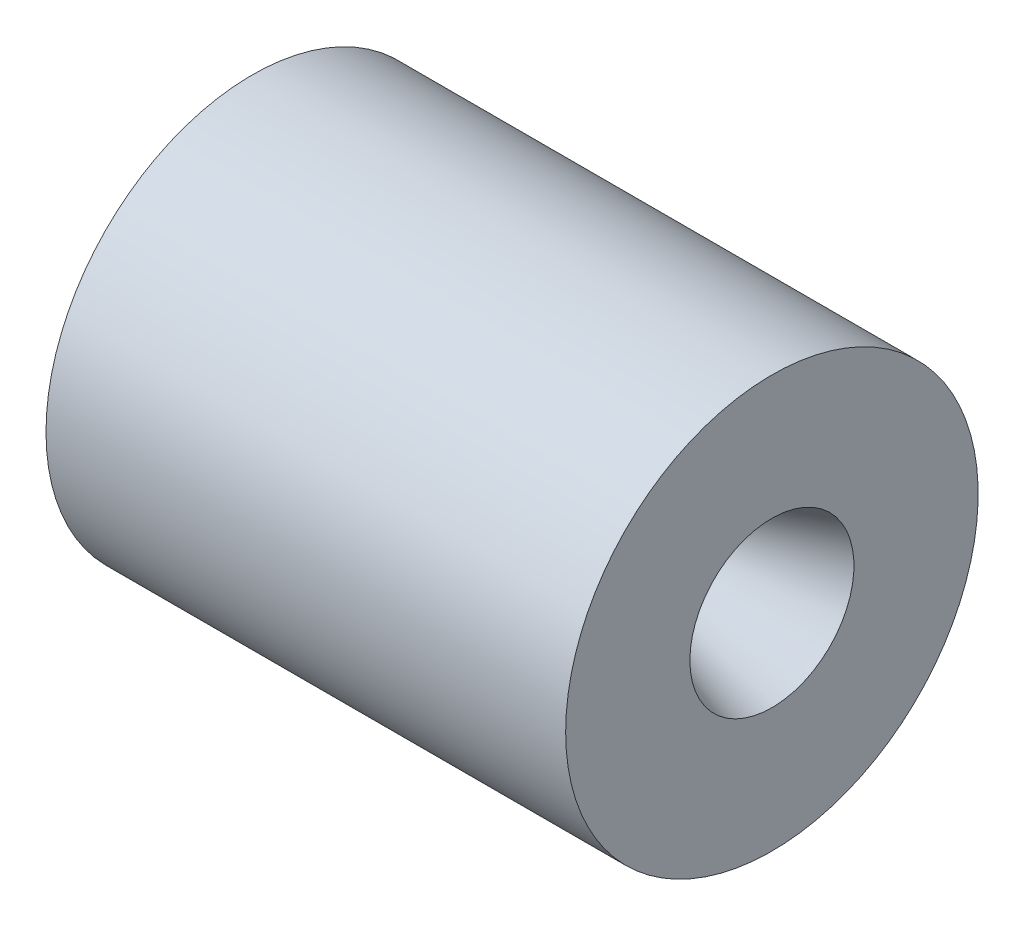
ISO-10303-21;
HEADER;
FILE_DESCRIPTION(('STEP AP214'),'2;1');
FILE_NAME('part.step','',(''),(''),'','','');
FILE_SCHEMA(('AUTOMOTIVE_DESIGN { 1 0 10303 214 1 1 1 1 }'));
ENDSEC;
DATA;
#1=APPLICATION_CONTEXT('core data for automotive mechanical design processes');
#2=APPLICATION_PROTOCOL_DEFINITION('international standard','automotive_design',2000,#1);
#3=PRODUCT_CONTEXT('',#1,'mechanical');
#4=PRODUCT('Part','Part','',(#3));
#5=PRODUCT_RELATED_PRODUCT_CATEGORY('part','',(#4));
#6=PRODUCT_DEFINITION_FORMATION('','',#4);
#7=PRODUCT_DEFINITION_CONTEXT('part definition',#1,'design');
#8=PRODUCT_DEFINITION('design','',#6,#7);
#9=PRODUCT_DEFINITION_SHAPE('','',#8);
#10=(LENGTH_UNIT() NAMED_UNIT(*) SI_UNIT(.MILLI.,.METRE.));
#11=(NAMED_UNIT(*) PLANE_ANGLE_UNIT() SI_UNIT($,.RADIAN.));
#12=(NAMED_UNIT(*) SI_UNIT($,.STERADIAN.) SOLID_ANGLE_UNIT());
#13=UNCERTAINTY_MEASURE_WITH_UNIT(LENGTH_MEASURE(1.E-05),#10,'distance_accuracy_value','');
#14=(GEOMETRIC_REPRESENTATION_CONTEXT(3) GLOBAL_UNCERTAINTY_ASSIGNED_CONTEXT((#13)) GLOBAL_UNIT_ASSIGNED_CONTEXT((#10,
#11,#12)) REPRESENTATION_CONTEXT('',''));
#15=CARTESIAN_POINT('',(0.,0.,0.));
#16=DIRECTION('',(0.,0.,1.));
#17=DIRECTION('',(1.,0.,0.));
#18=AXIS2_PLACEMENT_3D('',#15,#16,#17);
#19=CARTESIAN_POINT('',(144.075603175273,14.4149415335064,0.));
#20=CARTESIAN_POINT('',(185.934060842536,28.7220027214774,0.));
#21=CARTESIAN_POINT('',(190.226374916846,30.0329188050204,0.));
#22=B_SPLINE_CURVE_WITH_KNOTS('',2,(#19,#20,#21),.UNSPECIFIED.,.F.,.F.,(3,3),(0.,1.),.UNSPECIFIED.);
#23=CARTESIAN_POINT('',(0.,0.,0.));
#24=DIRECTION('',(-1.,0.,0.));
#25=AXIS1_PLACEMENT('',#23,#24);
#26=SURFACE_OF_REVOLUTION('',#22,#25);
#27=CARTESIAN_POINT('',(190.226374916846,0.,0.));
#28=DIRECTION('',(-1.,0.,0.));
#29=DIRECTION('',(0.,0.,1.));
#30=AXIS2_PLACEMENT_3D('',#27,#28,#29);
#31=CIRCLE('',#30,30.0329188050204);
#32=CARTESIAN_POINT('',(190.226374916846,0.,30.0329188050204));
#33=VERTEX_POINT('',#32);
#34=EDGE_CURVE('E10',#33,#33,#31,.T.);
#35=ORIENTED_EDGE('',*,*,#34,.F.);
#36=EDGE_LOOP('',(#35));
#37=FACE_BOUND('',#36,.T.);
#38=CARTESIAN_POINT('',(144.075603175273,0.,0.));
#39=DIRECTION('',(-1.,0.,0.));
#40=DIRECTION('',(0.,0.,1.));
#41=AXIS2_PLACEMENT_3D('',#38,#39,#40);
#42=CIRCLE('',#41,14.4149415335064);
#43=CARTESIAN_POINT('',(144.075603175273,0.,14.4149415335064));
#44=VERTEX_POINT('',#43);
#45=EDGE_CURVE('E67',#44,#44,#42,.T.);
#46=ORIENTED_EDGE('',*,*,#45,.T.);
#47=EDGE_LOOP('',(#46));
#48=FACE_BOUND('',#47,.T.);
#49=ADVANCED_FACE('F35',(#37,#48),#26,.T.);
#50=CARTESIAN_POINT('',(190.226374916846,75.4997615361086,0.));
#51=DIRECTION('',(-1.,0.,0.));
#52=DIRECTION('',(0.,0.,1.));
#53=AXIS2_PLACEMENT_3D('',#50,#51,#52);
#54=PLANE('',#53);
#55=CARTESIAN_POINT('',(190.226374916846,0.,0.));
#56=DIRECTION('',(-1.,0.,0.));
#57=DIRECTION('',(0.,0.,1.));
#58=AXIS2_PLACEMENT_3D('',#55,#56,#57);
#59=CIRCLE('',#58,75.4997615361086);
#60=CARTESIAN_POINT('',(190.226374916846,0.,75.4997615361086));
#61=VERTEX_POINT('',#60);
#62=EDGE_CURVE('E42',#61,#61,#59,.T.);
#63=ORIENTED_EDGE('',*,*,#62,.F.);
#64=EDGE_LOOP('',(#63));
#65=FACE_BOUND('',#64,.T.);
#66=ORIENTED_EDGE('',*,*,#34,.T.);
#67=EDGE_LOOP('',(#66));
#68=FACE_BOUND('',#67,.T.);
#69=ADVANCED_FACE('F116',(#65,#68),#54,.F.);
#70=CARTESIAN_POINT('',(0.,0.,0.));
#71=DIRECTION('',(-1.,0.,0.));
#72=DIRECTION('',(0.,0.,1.));
#73=AXIS2_PLACEMENT_3D('',#70,#71,#72);
#74=CYLINDRICAL_SURFACE('',#73,75.4997615361086);
#75=CARTESIAN_POINT('',(0.,0.,0.));
#76=DIRECTION('',(-1.,0.,0.));
#77=DIRECTION('',(0.,0.,1.));
#78=AXIS2_PLACEMENT_3D('',#75,#76,#77);
#79=CIRCLE('',#78,75.4997615361086);
#80=CARTESIAN_POINT('',(0.,0.,75.4997615361086));
#81=VERTEX_POINT('',#80);
#82=EDGE_CURVE('E46',#81,#81,#79,.T.);
#83=ORIENTED_EDGE('',*,*,#82,.F.);
#84=EDGE_LOOP('',(#83));
#85=FACE_BOUND('',#84,.T.);
#86=ORIENTED_EDGE('',*,*,#62,.T.);
#87=EDGE_LOOP('',(#86));
#88=FACE_BOUND('',#87,.T.);
#89=ADVANCED_FACE('F111',(#85,#88),#74,.T.);
#90=CARTESIAN_POINT('',(0.,56.4997615361086,0.));
#91=DIRECTION('',(1.,0.,0.));
#92=DIRECTION('',(0.,0.,-1.));
#93=AXIS2_PLACEMENT_3D('',#90,#91,#92);
#94=PLANE('',#93);
#95=CARTESIAN_POINT('',(0.,0.,0.));
#96=DIRECTION('',(-1.,0.,0.));
#97=DIRECTION('',(0.,0.,1.));
#98=AXIS2_PLACEMENT_3D('',#95,#96,#97);
#99=CIRCLE('',#98,56.4997615361086);
#100=CARTESIAN_POINT('',(0.,0.,56.4997615361086));
#101=VERTEX_POINT('',#100);
#102=EDGE_CURVE('E50',#101,#101,#99,.T.);
#103=ORIENTED_EDGE('',*,*,#102,.F.);
#104=EDGE_LOOP('',(#103));
#105=FACE_BOUND('',#104,.T.);
#106=ORIENTED_EDGE('',*,*,#82,.T.);
#107=EDGE_LOOP('',(#106));
#108=FACE_BOUND('',#107,.T.);
#109=ADVANCED_FACE('F105',(#105,#108),#94,.F.);
#110=CARTESIAN_POINT('',(0.,0.,0.));
#111=DIRECTION('',(-1.,0.,0.));
#112=DIRECTION('',(0.,0.,1.));
#113=AXIS2_PLACEMENT_3D('',#110,#111,#112);
#114=CYLINDRICAL_SURFACE('',#113,56.4997615361085);
#115=CARTESIAN_POINT('',(23.7217474431839,0.,0.));
#116=DIRECTION('',(-1.,0.,0.));
#117=DIRECTION('',(0.,0.,1.));
#118=AXIS2_PLACEMENT_3D('',#115,#116,#117);
#119=CIRCLE('',#118,56.4997615361085);
#120=CARTESIAN_POINT('',(23.7217474431839,0.,56.4997615361085));
#121=VERTEX_POINT('',#120);
#122=EDGE_CURVE('E55',#121,#121,#119,.T.);
#123=ORIENTED_EDGE('',*,*,#122,.F.);
#124=EDGE_LOOP('',(#123));
#125=FACE_BOUND('',#124,.T.);
#126=ORIENTED_EDGE('',*,*,#102,.T.);
#127=EDGE_LOOP('',(#126));
#128=FACE_BOUND('',#127,.T.);
#129=ADVANCED_FACE('F99',(#125,#128),#114,.F.);
#130=CARTESIAN_POINT('',(23.7217458666149,0.,0.));
#131=DIRECTION('',(-1.,0.,0.));
#132=DIRECTION('',(0.,0.,1.));
#133=AXIS2_PLACEMENT_3D('',#130,#131,#132);
#134=DEGENERATE_TOROIDAL_SURFACE('',#133,91.0515171550855,147.551278691194,.F.);
#135=CARTESIAN_POINT('',(97.4973867887809,0.,0.));
#136=DIRECTION('',(-1.,0.,0.));
#137=DIRECTION('',(0.,0.,1.));
#138=AXIS2_PLACEMENT_3D('',#135,#136,#137);
#139=CIRCLE('',#138,36.7316376421335);
#140=CARTESIAN_POINT('',(97.4973867887809,0.,36.7316376421335));
#141=VERTEX_POINT('',#140);
#142=EDGE_CURVE('E58',#141,#141,#139,.T.);
#143=ORIENTED_EDGE('',*,*,#142,.F.);
#144=EDGE_LOOP('',(#143));
#145=FACE_BOUND('',#144,.T.);
#146=ORIENTED_EDGE('',*,*,#122,.T.);
#147=EDGE_LOOP('',(#146));
#148=FACE_BOUND('',#147,.T.);
#149=ADVANCED_FACE('F93',(#145,#148),#134,.T.);
#150=CARTESIAN_POINT('',(97.4973867887809,0.,0.));
#151=DIRECTION('',(-1.,0.,0.));
#152=DIRECTION('',(0.,0.,1.));
#153=AXIS2_PLACEMENT_3D('',#150,#151,#152);
#154=CONICAL_SURFACE('',#153,36.7316376421335,0.523598775598299);
#155=CARTESIAN_POINT('',(131.73678028898,0.,0.));
#156=DIRECTION('',(-1.,0.,0.));
#157=DIRECTION('',(0.,0.,1.));
#158=AXIS2_PLACEMENT_3D('',#155,#156,#157);
#159=CIRCLE('',#158,16.9635145879038);
#160=CARTESIAN_POINT('',(131.73678028898,0.,16.9635145879038));
#161=VERTEX_POINT('',#160);
#162=EDGE_CURVE('E61',#161,#161,#159,.T.);
#163=ORIENTED_EDGE('',*,*,#162,.F.);
#164=EDGE_LOOP('',(#163));
#165=FACE_BOUND('',#164,.T.);
#166=ORIENTED_EDGE('',*,*,#142,.T.);
#167=EDGE_LOOP('',(#166));
#168=FACE_BOUND('',#167,.T.);
#169=ADVANCED_FACE('F87',(#165,#168),#154,.F.);
#170=CARTESIAN_POINT('',(142.330484904979,0.,0.));
#171=DIRECTION('',(-1.,0.,0.));
#172=DIRECTION('',(0.,0.,1.));
#173=AXIS2_PLACEMENT_3D('',#170,#171,#172);
#174=TOROIDAL_SURFACE('',#173,35.3123507751581,21.1874105760407);
#175=CARTESIAN_POINT('',(142.330485577001,0.,0.));
#176=DIRECTION('',(-1.,0.,0.));
#177=DIRECTION('',(0.,0.,1.));
#178=AXIS2_PLACEMENT_3D('',#175,#176,#177);
#179=CIRCLE('',#178,14.1249401991174);
#180=CARTESIAN_POINT('',(142.330485577001,0.,14.1249401991174));
#181=VERTEX_POINT('',#180);
#182=EDGE_CURVE('E64',#181,#181,#179,.T.);
#183=ORIENTED_EDGE('',*,*,#182,.F.);
#184=EDGE_LOOP('',(#183));
#185=FACE_BOUND('',#184,.T.);
#186=ORIENTED_EDGE('',*,*,#162,.T.);
#187=EDGE_LOOP('',(#186));
#188=FACE_BOUND('',#187,.T.);
#189=ADVANCED_FACE('F81',(#185,#188),#174,.T.);
#190=CARTESIAN_POINT('',(142.330485577001,0.,0.));
#191=DIRECTION('',(-1.,0.,0.));
#192=DIRECTION('',(0.,0.,1.));
#193=AXIS2_PLACEMENT_3D('',#190,#191,#192);
#194=TOROIDAL_SURFACE('',#193,19.5206674504074,5.39572725129009);
#195=ORIENTED_EDGE('',*,*,#45,.F.);
#196=EDGE_LOOP('',(#195));
#197=FACE_BOUND('',#196,.T.);
#198=ORIENTED_EDGE('',*,*,#182,.T.);
#199=EDGE_LOOP('',(#198));
#200=FACE_BOUND('',#199,.T.);
#201=ADVANCED_FACE('F78',(#197,#200),#194,.T.);
#202=CLOSED_SHELL('',(#49,#69,#89,#109,#129,#149,#169,#189,#201));
#203=MANIFOLD_SOLID_BREP('B2',#202);
#204=ADVANCED_BREP_SHAPE_REPRESENTATION('',(#18,#203),#14);
#205=SHAPE_DEFINITION_REPRESENTATION(#9,#204);
ENDSEC;
END-ISO-10303-21;
